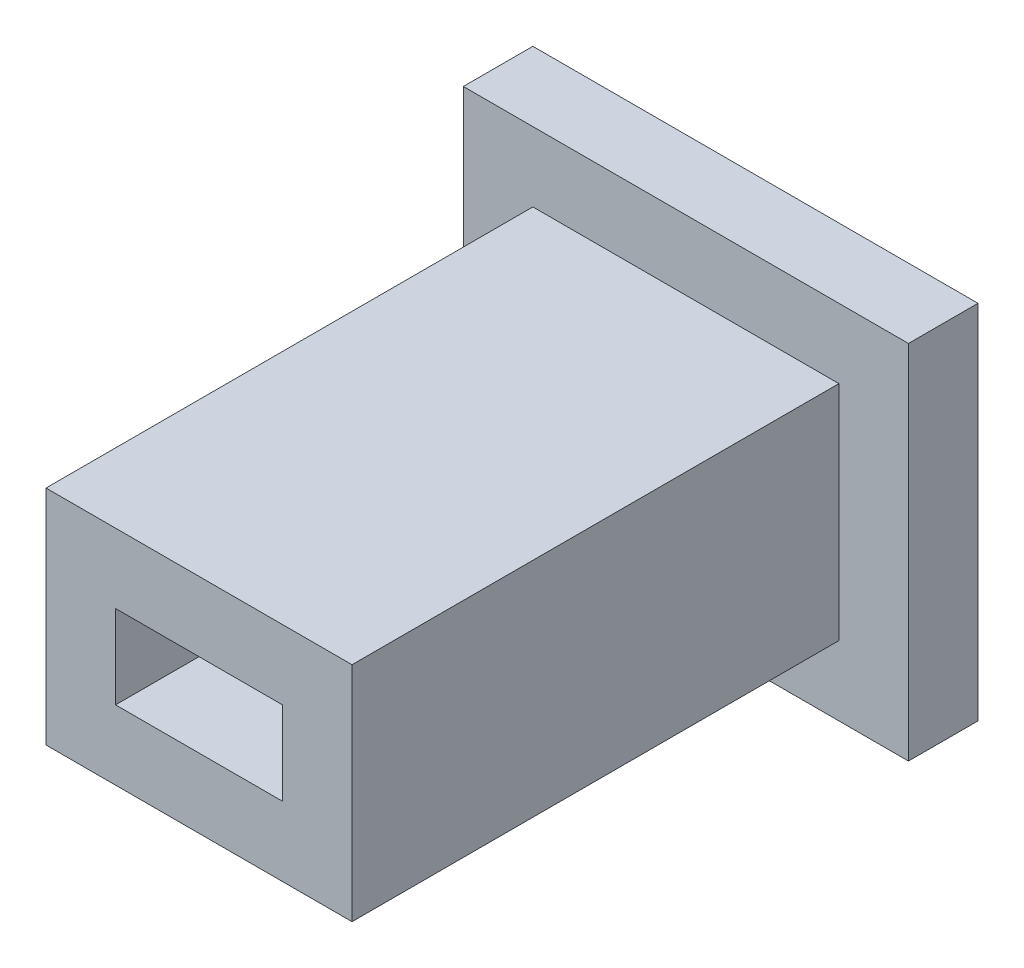
ISO-10303-21;
HEADER;
FILE_DESCRIPTION(('STEP AP214'),'2;1');
FILE_NAME('part.step','',(''),(''),'','','');
FILE_SCHEMA(('AUTOMOTIVE_DESIGN { 1 0 10303 214 1 1 1 1 }'));
ENDSEC;
DATA;
#1=APPLICATION_CONTEXT('core data for automotive mechanical design processes');
#2=APPLICATION_PROTOCOL_DEFINITION('international standard','automotive_design',2000,#1);
#3=PRODUCT_CONTEXT('',#1,'mechanical');
#4=PRODUCT('Part','Part','',(#3));
#5=PRODUCT_RELATED_PRODUCT_CATEGORY('part','',(#4));
#6=PRODUCT_DEFINITION_FORMATION('','',#4);
#7=PRODUCT_DEFINITION_CONTEXT('part definition',#1,'design');
#8=PRODUCT_DEFINITION('design','',#6,#7);
#9=PRODUCT_DEFINITION_SHAPE('','',#8);
#10=(LENGTH_UNIT() NAMED_UNIT(*) SI_UNIT(.MILLI.,.METRE.));
#11=(NAMED_UNIT(*) PLANE_ANGLE_UNIT() SI_UNIT($,.RADIAN.));
#12=(NAMED_UNIT(*) SI_UNIT($,.STERADIAN.) SOLID_ANGLE_UNIT());
#13=UNCERTAINTY_MEASURE_WITH_UNIT(LENGTH_MEASURE(1.E-05),#10,'distance_accuracy_value','');
#14=(GEOMETRIC_REPRESENTATION_CONTEXT(3) GLOBAL_UNCERTAINTY_ASSIGNED_CONTEXT((#13)) GLOBAL_UNIT_ASSIGNED_CONTEXT((#10,
#11,#12)) REPRESENTATION_CONTEXT('',''));
#15=CARTESIAN_POINT('',(0.,0.,0.));
#16=DIRECTION('',(0.,0.,1.));
#17=DIRECTION('',(1.,0.,0.));
#18=AXIS2_PLACEMENT_3D('',#15,#16,#17);
#19=CARTESIAN_POINT('',(0.,0.,80.));
#20=DIRECTION('',(0.,0.,-1.));
#21=DIRECTION('',(-1.,0.,0.));
#22=AXIS2_PLACEMENT_3D('',#19,#20,#21);
#23=PLANE('',#22);
#24=DIRECTION('',(0.,1.,0.));
#25=VECTOR('',#24,1.);
#26=CARTESIAN_POINT('',(22.,-16.,80.));
#27=LINE('',#26,#25);
#28=CARTESIAN_POINT('',(22.,-16.,80.));
#29=VERTEX_POINT('',#28);
#30=CARTESIAN_POINT('',(22.,16.,80.));
#31=VERTEX_POINT('',#30);
#32=EDGE_CURVE('E154',#29,#31,#27,.T.);
#33=ORIENTED_EDGE('',*,*,#32,.T.);
#34=DIRECTION('',(-1.,0.,0.));
#35=VECTOR('',#34,1.);
#36=CARTESIAN_POINT('',(-22.,16.,80.));
#37=LINE('',#36,#35);
#38=CARTESIAN_POINT('',(-22.,16.,80.));
#39=VERTEX_POINT('',#38);
#40=EDGE_CURVE('E152',#31,#39,#37,.T.);
#41=ORIENTED_EDGE('',*,*,#40,.T.);
#42=DIRECTION('',(0.,-1.,0.));
#43=VECTOR('',#42,1.);
#44=CARTESIAN_POINT('',(-22.,-16.,80.));
#45=LINE('',#44,#43);
#46=CARTESIAN_POINT('',(-22.,-16.,80.));
#47=VERTEX_POINT('',#46);
#48=EDGE_CURVE('E142',#39,#47,#45,.T.);
#49=ORIENTED_EDGE('',*,*,#48,.T.);
#50=DIRECTION('',(1.,0.,0.));
#51=VECTOR('',#50,1.);
#52=CARTESIAN_POINT('',(-22.,-16.,80.));
#53=LINE('',#52,#51);
#54=EDGE_CURVE('E149',#47,#29,#53,.T.);
#55=ORIENTED_EDGE('',*,*,#54,.T.);
#56=EDGE_LOOP('',(#33,#41,#49,#55));
#57=FACE_BOUND('',#56,.T.);
#58=DIRECTION('',(0.,1.,0.));
#59=VECTOR('',#58,1.);
#60=CARTESIAN_POINT('',(12.,-6.,80.));
#61=LINE('',#60,#59);
#62=CARTESIAN_POINT('',(12.,-6.,80.));
#63=VERTEX_POINT('',#62);
#64=CARTESIAN_POINT('',(12.,6.,80.));
#65=VERTEX_POINT('',#64);
#66=EDGE_CURVE('E170',#63,#65,#61,.T.);
#67=ORIENTED_EDGE('',*,*,#66,.F.);
#68=DIRECTION('',(1.,0.,0.));
#69=VECTOR('',#68,1.);
#70=CARTESIAN_POINT('',(-12.,-6.,80.));
#71=LINE('',#70,#69);
#72=CARTESIAN_POINT('',(-12.,-6.,80.));
#73=VERTEX_POINT('',#72);
#74=EDGE_CURVE('E166',#73,#63,#71,.T.);
#75=ORIENTED_EDGE('',*,*,#74,.F.);
#76=DIRECTION('',(0.,-1.,0.));
#77=VECTOR('',#76,1.);
#78=CARTESIAN_POINT('',(-12.,-6.,80.));
#79=LINE('',#78,#77);
#80=CARTESIAN_POINT('',(-12.,6.,80.));
#81=VERTEX_POINT('',#80);
#82=EDGE_CURVE('E182',#81,#73,#79,.T.);
#83=ORIENTED_EDGE('',*,*,#82,.F.);
#84=DIRECTION('',(-1.,0.,0.));
#85=VECTOR('',#84,1.);
#86=CARTESIAN_POINT('',(-12.,6.,80.));
#87=LINE('',#86,#85);
#88=EDGE_CURVE('E184',#65,#81,#87,.T.);
#89=ORIENTED_EDGE('',*,*,#88,.F.);
#90=EDGE_LOOP('',(#67,#75,#83,#89));
#91=FACE_BOUND('',#90,.T.);
#92=ADVANCED_FACE('F37',(#57,#91),#23,.F.);
#93=CARTESIAN_POINT('',(0.,0.,0.));
#94=DIRECTION('',(0.,0.,-1.));
#95=DIRECTION('',(-1.,0.,0.));
#96=AXIS2_PLACEMENT_3D('',#93,#94,#95);
#97=PLANE('',#96);
#98=DIRECTION('',(1.,0.,0.));
#99=VECTOR('',#98,1.);
#100=CARTESIAN_POINT('',(-12.,-6.,0.));
#101=LINE('',#100,#99);
#102=CARTESIAN_POINT('',(-12.,-6.,0.));
#103=VERTEX_POINT('',#102);
#104=CARTESIAN_POINT('',(12.,-6.,0.));
#105=VERTEX_POINT('',#104);
#106=EDGE_CURVE('E167',#103,#105,#101,.T.);
#107=ORIENTED_EDGE('',*,*,#106,.T.);
#108=DIRECTION('',(0.,1.,0.));
#109=VECTOR('',#108,1.);
#110=CARTESIAN_POINT('',(12.,-6.,0.));
#111=LINE('',#110,#109);
#112=CARTESIAN_POINT('',(12.,6.,0.));
#113=VERTEX_POINT('',#112);
#114=EDGE_CURVE('E177',#105,#113,#111,.T.);
#115=ORIENTED_EDGE('',*,*,#114,.T.);
#116=DIRECTION('',(-1.,0.,0.));
#117=VECTOR('',#116,1.);
#118=CARTESIAN_POINT('',(-12.,6.,0.));
#119=LINE('',#118,#117);
#120=CARTESIAN_POINT('',(-12.,6.,0.));
#121=VERTEX_POINT('',#120);
#122=EDGE_CURVE('E174',#113,#121,#119,.T.);
#123=ORIENTED_EDGE('',*,*,#122,.T.);
#124=DIRECTION('',(0.,-1.,0.));
#125=VECTOR('',#124,1.);
#126=CARTESIAN_POINT('',(-12.,-6.,0.));
#127=LINE('',#126,#125);
#128=EDGE_CURVE('E171',#121,#103,#127,.T.);
#129=ORIENTED_EDGE('',*,*,#128,.T.);
#130=EDGE_LOOP('',(#107,#115,#123,#129));
#131=FACE_BOUND('',#130,.T.);
#132=DIRECTION('',(0.,1.,0.));
#133=VECTOR('',#132,1.);
#134=CARTESIAN_POINT('',(-32.,-26.,0.));
#135=LINE('',#134,#133);
#136=CARTESIAN_POINT('',(-32.,-26.,0.));
#137=VERTEX_POINT('',#136);
#138=CARTESIAN_POINT('',(-32.,26.,0.));
#139=VERTEX_POINT('',#138);
#140=EDGE_CURVE('E205',#137,#139,#135,.T.);
#141=ORIENTED_EDGE('',*,*,#140,.T.);
#142=DIRECTION('',(1.,0.,0.));
#143=VECTOR('',#142,1.);
#144=CARTESIAN_POINT('',(32.,26.,0.));
#145=LINE('',#144,#143);
#146=CARTESIAN_POINT('',(32.,26.,0.));
#147=VERTEX_POINT('',#146);
#148=EDGE_CURVE('E202',#139,#147,#145,.T.);
#149=ORIENTED_EDGE('',*,*,#148,.T.);
#150=DIRECTION('',(0.,-1.,0.));
#151=VECTOR('',#150,1.);
#152=CARTESIAN_POINT('',(32.,-26.,0.));
#153=LINE('',#152,#151);
#154=CARTESIAN_POINT('',(32.,-26.,0.));
#155=VERTEX_POINT('',#154);
#156=EDGE_CURVE('E199',#147,#155,#153,.T.);
#157=ORIENTED_EDGE('',*,*,#156,.T.);
#158=DIRECTION('',(-1.,0.,0.));
#159=VECTOR('',#158,1.);
#160=CARTESIAN_POINT('',(32.,-26.,0.));
#161=LINE('',#160,#159);
#162=EDGE_CURVE('E195',#155,#137,#161,.T.);
#163=ORIENTED_EDGE('',*,*,#162,.T.);
#164=EDGE_LOOP('',(#141,#149,#157,#163));
#165=FACE_BOUND('',#164,.T.);
#166=ADVANCED_FACE('F236',(#131,#165),#97,.T.);
#167=CARTESIAN_POINT('',(22.,-16.,80.));
#168=DIRECTION('',(-1.,0.,0.));
#169=DIRECTION('',(0.,0.,1.));
#170=AXIS2_PLACEMENT_3D('',#167,#168,#169);
#171=PLANE('',#170);
#172=DIRECTION('',(0.,0.,-1.));
#173=VECTOR('',#172,1.);
#174=CARTESIAN_POINT('',(22.,-16.,80.));
#175=LINE('',#174,#173);
#176=CARTESIAN_POINT('',(22.,-16.,9.99999999999999));
#177=VERTEX_POINT('',#176);
#178=EDGE_CURVE('E144',#29,#177,#175,.T.);
#179=ORIENTED_EDGE('',*,*,#178,.T.);
#180=DIRECTION('',(0.,-1.,0.));
#181=VECTOR('',#180,1.);
#182=CARTESIAN_POINT('',(22.,-16.,10.));
#183=LINE('',#182,#181);
#184=CARTESIAN_POINT('',(22.,16.,10.));
#185=VERTEX_POINT('',#184);
#186=EDGE_CURVE('E52',#185,#177,#183,.T.);
#187=ORIENTED_EDGE('',*,*,#186,.F.);
#188=DIRECTION('',(0.,0.,-1.));
#189=VECTOR('',#188,1.);
#190=CARTESIAN_POINT('',(22.,16.,80.));
#191=LINE('',#190,#189);
#192=EDGE_CURVE('E11',#31,#185,#191,.T.);
#193=ORIENTED_EDGE('',*,*,#192,.F.);
#194=ORIENTED_EDGE('',*,*,#32,.F.);
#195=EDGE_LOOP('',(#179,#187,#193,#194));
#196=FACE_BOUND('',#195,.T.);
#197=ADVANCED_FACE('F39',(#196),#171,.F.);
#198=CARTESIAN_POINT('',(-22.,16.,80.));
#199=DIRECTION('',(0.,-1.,0.));
#200=DIRECTION('',(0.,0.,-1.));
#201=AXIS2_PLACEMENT_3D('',#198,#199,#200);
#202=PLANE('',#201);
#203=ORIENTED_EDGE('',*,*,#192,.T.);
#204=DIRECTION('',(1.,0.,0.));
#205=VECTOR('',#204,1.);
#206=CARTESIAN_POINT('',(22.,16.,10.));
#207=LINE('',#206,#205);
#208=CARTESIAN_POINT('',(-22.,16.,10.));
#209=VERTEX_POINT('',#208);
#210=EDGE_CURVE('E128',#209,#185,#207,.T.);
#211=ORIENTED_EDGE('',*,*,#210,.F.);
#212=DIRECTION('',(0.,0.,-1.));
#213=VECTOR('',#212,1.);
#214=CARTESIAN_POINT('',(-22.,16.,80.));
#215=LINE('',#214,#213);
#216=EDGE_CURVE('E45',#39,#209,#215,.T.);
#217=ORIENTED_EDGE('',*,*,#216,.F.);
#218=ORIENTED_EDGE('',*,*,#40,.F.);
#219=EDGE_LOOP('',(#203,#211,#217,#218));
#220=FACE_BOUND('',#219,.T.);
#221=ADVANCED_FACE('F137',(#220),#202,.F.);
#222=CARTESIAN_POINT('',(-22.,-16.,80.));
#223=DIRECTION('',(1.,0.,0.));
#224=DIRECTION('',(0.,0.,-1.));
#225=AXIS2_PLACEMENT_3D('',#222,#223,#224);
#226=PLANE('',#225);
#227=ORIENTED_EDGE('',*,*,#216,.T.);
#228=DIRECTION('',(0.,1.,0.));
#229=VECTOR('',#228,1.);
#230=CARTESIAN_POINT('',(-22.,-16.,10.));
#231=LINE('',#230,#229);
#232=CARTESIAN_POINT('',(-22.,-16.,10.));
#233=VERTEX_POINT('',#232);
#234=EDGE_CURVE('E124',#233,#209,#231,.T.);
#235=ORIENTED_EDGE('',*,*,#234,.F.);
#236=DIRECTION('',(0.,0.,-1.));
#237=VECTOR('',#236,1.);
#238=CARTESIAN_POINT('',(-22.,-16.,80.));
#239=LINE('',#238,#237);
#240=EDGE_CURVE('E143',#47,#233,#239,.T.);
#241=ORIENTED_EDGE('',*,*,#240,.F.);
#242=ORIENTED_EDGE('',*,*,#48,.F.);
#243=EDGE_LOOP('',(#227,#235,#241,#242));
#244=FACE_BOUND('',#243,.T.);
#245=ADVANCED_FACE('F141',(#244),#226,.F.);
#246=CARTESIAN_POINT('',(-22.,-16.,80.));
#247=DIRECTION('',(0.,1.,0.));
#248=DIRECTION('',(0.,0.,1.));
#249=AXIS2_PLACEMENT_3D('',#246,#247,#248);
#250=PLANE('',#249);
#251=ORIENTED_EDGE('',*,*,#240,.T.);
#252=DIRECTION('',(-1.,0.,0.));
#253=VECTOR('',#252,1.);
#254=CARTESIAN_POINT('',(22.,-16.,10.));
#255=LINE('',#254,#253);
#256=EDGE_CURVE('E129',#177,#233,#255,.T.);
#257=ORIENTED_EDGE('',*,*,#256,.F.);
#258=ORIENTED_EDGE('',*,*,#178,.F.);
#259=ORIENTED_EDGE('',*,*,#54,.F.);
#260=EDGE_LOOP('',(#251,#257,#258,#259));
#261=FACE_BOUND('',#260,.T.);
#262=ADVANCED_FACE('F249',(#261),#250,.F.);
#263=CARTESIAN_POINT('',(12.,-6.,80.));
#264=DIRECTION('',(-1.,0.,0.));
#265=DIRECTION('',(0.,0.,1.));
#266=AXIS2_PLACEMENT_3D('',#263,#264,#265);
#267=PLANE('',#266);
#268=ORIENTED_EDGE('',*,*,#114,.F.);
#269=DIRECTION('',(0.,0.,-1.));
#270=VECTOR('',#269,1.);
#271=CARTESIAN_POINT('',(12.,-6.,80.));
#272=LINE('',#271,#270);
#273=EDGE_CURVE('E163',#63,#105,#272,.T.);
#274=ORIENTED_EDGE('',*,*,#273,.F.);
#275=ORIENTED_EDGE('',*,*,#66,.T.);
#276=DIRECTION('',(0.,0.,-1.));
#277=VECTOR('',#276,1.);
#278=CARTESIAN_POINT('',(12.,6.,80.));
#279=LINE('',#278,#277);
#280=EDGE_CURVE('E157',#65,#113,#279,.T.);
#281=ORIENTED_EDGE('',*,*,#280,.T.);
#282=EDGE_LOOP('',(#268,#274,#275,#281));
#283=FACE_BOUND('',#282,.T.);
#284=ADVANCED_FACE('F252',(#283),#267,.T.);
#285=CARTESIAN_POINT('',(-12.,6.,80.));
#286=DIRECTION('',(0.,-1.,0.));
#287=DIRECTION('',(0.,0.,-1.));
#288=AXIS2_PLACEMENT_3D('',#285,#286,#287);
#289=PLANE('',#288);
#290=ORIENTED_EDGE('',*,*,#122,.F.);
#291=ORIENTED_EDGE('',*,*,#280,.F.);
#292=ORIENTED_EDGE('',*,*,#88,.T.);
#293=DIRECTION('',(0.,0.,-1.));
#294=VECTOR('',#293,1.);
#295=CARTESIAN_POINT('',(-12.,6.,80.));
#296=LINE('',#295,#294);
#297=EDGE_CURVE('E160',#81,#121,#296,.T.);
#298=ORIENTED_EDGE('',*,*,#297,.T.);
#299=EDGE_LOOP('',(#290,#291,#292,#298));
#300=FACE_BOUND('',#299,.T.);
#301=ADVANCED_FACE('F275',(#300),#289,.T.);
#302=CARTESIAN_POINT('',(-12.,-6.,80.));
#303=DIRECTION('',(1.,0.,0.));
#304=DIRECTION('',(0.,0.,-1.));
#305=AXIS2_PLACEMENT_3D('',#302,#303,#304);
#306=PLANE('',#305);
#307=ORIENTED_EDGE('',*,*,#128,.F.);
#308=ORIENTED_EDGE('',*,*,#297,.F.);
#309=ORIENTED_EDGE('',*,*,#82,.T.);
#310=DIRECTION('',(0.,0.,-1.));
#311=VECTOR('',#310,1.);
#312=CARTESIAN_POINT('',(-12.,-6.,80.));
#313=LINE('',#312,#311);
#314=EDGE_CURVE('E60',#73,#103,#313,.T.);
#315=ORIENTED_EDGE('',*,*,#314,.T.);
#316=EDGE_LOOP('',(#307,#308,#309,#315));
#317=FACE_BOUND('',#316,.T.);
#318=ADVANCED_FACE('F283',(#317),#306,.T.);
#319=CARTESIAN_POINT('',(-12.,-6.,80.));
#320=DIRECTION('',(0.,1.,0.));
#321=DIRECTION('',(0.,0.,1.));
#322=AXIS2_PLACEMENT_3D('',#319,#320,#321);
#323=PLANE('',#322);
#324=ORIENTED_EDGE('',*,*,#106,.F.);
#325=ORIENTED_EDGE('',*,*,#314,.F.);
#326=ORIENTED_EDGE('',*,*,#74,.T.);
#327=ORIENTED_EDGE('',*,*,#273,.T.);
#328=EDGE_LOOP('',(#324,#325,#326,#327));
#329=FACE_BOUND('',#328,.T.);
#330=ADVANCED_FACE('F291',(#329),#323,.T.);
#331=CARTESIAN_POINT('',(-32.,-26.,10.));
#332=DIRECTION('',(-1.,0.,0.));
#333=DIRECTION('',(0.,0.,1.));
#334=AXIS2_PLACEMENT_3D('',#331,#332,#333);
#335=PLANE('',#334);
#336=ORIENTED_EDGE('',*,*,#140,.F.);
#337=DIRECTION('',(0.,0.,-1.));
#338=VECTOR('',#337,1.);
#339=CARTESIAN_POINT('',(-32.,-26.,10.));
#340=LINE('',#339,#338);
#341=CARTESIAN_POINT('',(-32.,-26.,10.));
#342=VERTEX_POINT('',#341);
#343=EDGE_CURVE('E180',#342,#137,#340,.T.);
#344=ORIENTED_EDGE('',*,*,#343,.F.);
#345=DIRECTION('',(0.,1.,0.));
#346=VECTOR('',#345,1.);
#347=CARTESIAN_POINT('',(-32.,-26.,10.));
#348=LINE('',#347,#346);
#349=CARTESIAN_POINT('',(-32.,26.,10.));
#350=VERTEX_POINT('',#349);
#351=EDGE_CURVE('E198',#342,#350,#348,.T.);
#352=ORIENTED_EDGE('',*,*,#351,.T.);
#353=DIRECTION('',(0.,0.,-1.));
#354=VECTOR('',#353,1.);
#355=CARTESIAN_POINT('',(-32.,26.,10.));
#356=LINE('',#355,#354);
#357=EDGE_CURVE('E187',#350,#139,#356,.T.);
#358=ORIENTED_EDGE('',*,*,#357,.T.);
#359=EDGE_LOOP('',(#336,#344,#352,#358));
#360=FACE_BOUND('',#359,.T.);
#361=ADVANCED_FACE('F222',(#360),#335,.T.);
#362=CARTESIAN_POINT('',(32.,-26.,10.));
#363=DIRECTION('',(0.,-1.,0.));
#364=DIRECTION('',(0.,0.,-1.));
#365=AXIS2_PLACEMENT_3D('',#362,#363,#364);
#366=PLANE('',#365);
#367=ORIENTED_EDGE('',*,*,#162,.F.);
#368=DIRECTION('',(0.,0.,-1.));
#369=VECTOR('',#368,1.);
#370=CARTESIAN_POINT('',(32.,-26.,10.));
#371=LINE('',#370,#369);
#372=CARTESIAN_POINT('',(32.,-26.,10.));
#373=VERTEX_POINT('',#372);
#374=EDGE_CURVE('E192',#373,#155,#371,.T.);
#375=ORIENTED_EDGE('',*,*,#374,.F.);
#376=DIRECTION('',(-1.,0.,0.));
#377=VECTOR('',#376,1.);
#378=CARTESIAN_POINT('',(32.,-26.,10.));
#379=LINE('',#378,#377);
#380=EDGE_CURVE('E190',#373,#342,#379,.T.);
#381=ORIENTED_EDGE('',*,*,#380,.T.);
#382=ORIENTED_EDGE('',*,*,#343,.T.);
#383=EDGE_LOOP('',(#367,#375,#381,#382));
#384=FACE_BOUND('',#383,.T.);
#385=ADVANCED_FACE('F229',(#384),#366,.T.);
#386=CARTESIAN_POINT('',(32.,-26.,10.));
#387=DIRECTION('',(1.,0.,0.));
#388=DIRECTION('',(0.,0.,-1.));
#389=AXIS2_PLACEMENT_3D('',#386,#387,#388);
#390=PLANE('',#389);
#391=ORIENTED_EDGE('',*,*,#156,.F.);
#392=DIRECTION('',(0.,0.,-1.));
#393=VECTOR('',#392,1.);
#394=CARTESIAN_POINT('',(32.,26.,10.));
#395=LINE('',#394,#393);
#396=CARTESIAN_POINT('',(32.,26.,10.));
#397=VERTEX_POINT('',#396);
#398=EDGE_CURVE('E189',#397,#147,#395,.T.);
#399=ORIENTED_EDGE('',*,*,#398,.F.);
#400=DIRECTION('',(0.,-1.,0.));
#401=VECTOR('',#400,1.);
#402=CARTESIAN_POINT('',(32.,-26.,10.));
#403=LINE('',#402,#401);
#404=EDGE_CURVE('E210',#397,#373,#403,.T.);
#405=ORIENTED_EDGE('',*,*,#404,.T.);
#406=ORIENTED_EDGE('',*,*,#374,.T.);
#407=EDGE_LOOP('',(#391,#399,#405,#406));
#408=FACE_BOUND('',#407,.T.);
#409=ADVANCED_FACE('F232',(#408),#390,.T.);
#410=CARTESIAN_POINT('',(32.,26.,10.));
#411=DIRECTION('',(0.,1.,0.));
#412=DIRECTION('',(0.,0.,1.));
#413=AXIS2_PLACEMENT_3D('',#410,#411,#412);
#414=PLANE('',#413);
#415=ORIENTED_EDGE('',*,*,#148,.F.);
#416=ORIENTED_EDGE('',*,*,#357,.F.);
#417=DIRECTION('',(1.,0.,0.));
#418=VECTOR('',#417,1.);
#419=CARTESIAN_POINT('',(32.,26.,10.));
#420=LINE('',#419,#418);
#421=EDGE_CURVE('E213',#350,#397,#420,.T.);
#422=ORIENTED_EDGE('',*,*,#421,.T.);
#423=ORIENTED_EDGE('',*,*,#398,.T.);
#424=EDGE_LOOP('',(#415,#416,#422,#423));
#425=FACE_BOUND('',#424,.T.);
#426=ADVANCED_FACE('F234',(#425),#414,.T.);
#427=CARTESIAN_POINT('',(0.,0.,10.));
#428=DIRECTION('',(0.,0.,1.));
#429=DIRECTION('',(1.,0.,0.));
#430=AXIS2_PLACEMENT_3D('',#427,#428,#429);
#431=PLANE('',#430);
#432=ORIENTED_EDGE('',*,*,#234,.T.);
#433=ORIENTED_EDGE('',*,*,#210,.T.);
#434=ORIENTED_EDGE('',*,*,#186,.T.);
#435=ORIENTED_EDGE('',*,*,#256,.T.);
#436=EDGE_LOOP('',(#432,#433,#434,#435));
#437=FACE_BOUND('',#436,.T.);
#438=ORIENTED_EDGE('',*,*,#351,.F.);
#439=ORIENTED_EDGE('',*,*,#380,.F.);
#440=ORIENTED_EDGE('',*,*,#404,.F.);
#441=ORIENTED_EDGE('',*,*,#421,.F.);
#442=EDGE_LOOP('',(#438,#439,#440,#441));
#443=FACE_BOUND('',#442,.T.);
#444=ADVANCED_FACE('F126',(#437,#443),#431,.T.);
#445=CLOSED_SHELL('',(#92,#166,#197,#221,#245,#262,#284,#301,#318,#330,#361,#385,#409,#426,#444));
#446=MANIFOLD_SOLID_BREP('B2',#445);
#447=ADVANCED_BREP_SHAPE_REPRESENTATION('',(#18,#446),#14);
#448=SHAPE_DEFINITION_REPRESENTATION(#9,#447);
ENDSEC;
END-ISO-10303-21;
